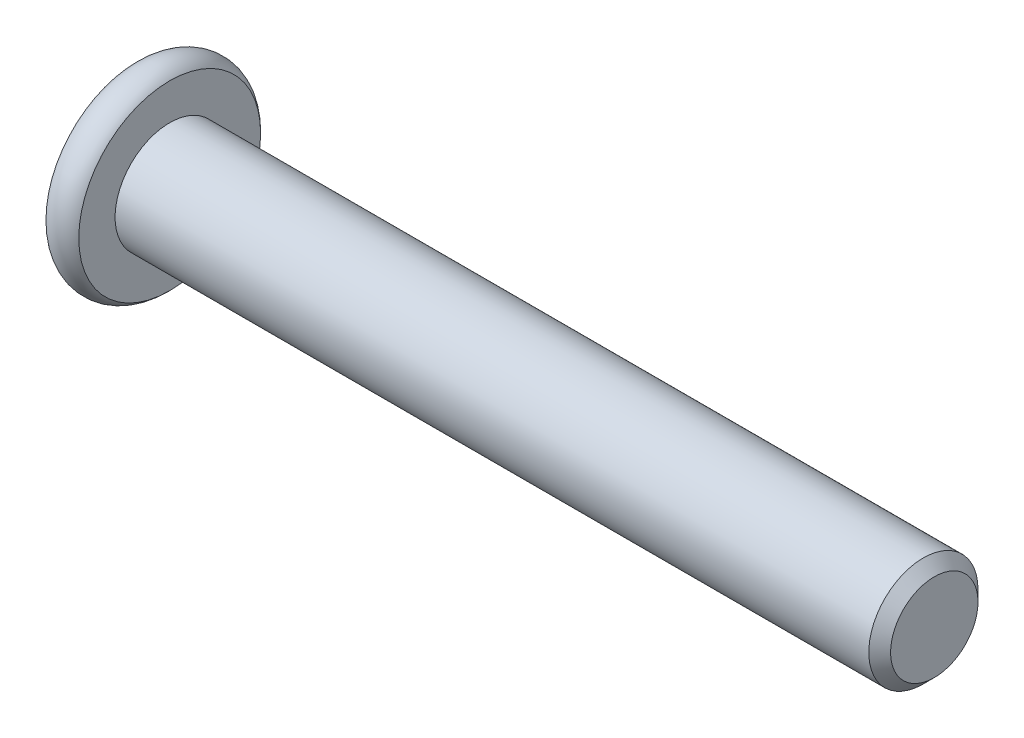
ISO-10303-21;
HEADER;
FILE_DESCRIPTION(('STEP AP214'),'2;1');
FILE_NAME('part.step','',(''),(''),'','','');
FILE_SCHEMA(('AUTOMOTIVE_DESIGN { 1 0 10303 214 1 1 1 1 }'));
ENDSEC;
DATA;
#1=APPLICATION_CONTEXT('core data for automotive mechanical design processes');
#2=APPLICATION_PROTOCOL_DEFINITION('international standard','automotive_design',2000,#1);
#3=PRODUCT_CONTEXT('',#1,'mechanical');
#4=PRODUCT('Part','Part','',(#3));
#5=PRODUCT_RELATED_PRODUCT_CATEGORY('part','',(#4));
#6=PRODUCT_DEFINITION_FORMATION('','',#4);
#7=PRODUCT_DEFINITION_CONTEXT('part definition',#1,'design');
#8=PRODUCT_DEFINITION('design','',#6,#7);
#9=PRODUCT_DEFINITION_SHAPE('','',#8);
#10=(LENGTH_UNIT() NAMED_UNIT(*) SI_UNIT(.MILLI.,.METRE.));
#11=(NAMED_UNIT(*) PLANE_ANGLE_UNIT() SI_UNIT($,.RADIAN.));
#12=(NAMED_UNIT(*) SI_UNIT($,.STERADIAN.) SOLID_ANGLE_UNIT());
#13=UNCERTAINTY_MEASURE_WITH_UNIT(LENGTH_MEASURE(1.E-05),#10,'distance_accuracy_value','');
#14=(GEOMETRIC_REPRESENTATION_CONTEXT(3) GLOBAL_UNCERTAINTY_ASSIGNED_CONTEXT((#13)) GLOBAL_UNIT_ASSIGNED_CONTEXT((#10,
#11,#12)) REPRESENTATION_CONTEXT('',''));
#15=CARTESIAN_POINT('',(0.,0.,0.));
#16=DIRECTION('',(0.,0.,1.));
#17=DIRECTION('',(1.,0.,0.));
#18=AXIS2_PLACEMENT_3D('',#15,#16,#17);
#19=CARTESIAN_POINT('',(-35.,0.,0.));
#20=DIRECTION('',(1.,0.,0.));
#21=DIRECTION('',(0.,0.,-1.));
#22=AXIS2_PLACEMENT_3D('',#19,#20,#21);
#23=CYLINDRICAL_SURFACE('',#22,2.5);
#24=CARTESIAN_POINT('',(-0.5,0.,0.));
#25=DIRECTION('',(1.,0.,0.));
#26=DIRECTION('',(0.,0.,-1.));
#27=AXIS2_PLACEMENT_3D('',#24,#25,#26);
#28=CIRCLE('',#27,2.5);
#29=CARTESIAN_POINT('',(-0.5,0.,-2.5));
#30=VERTEX_POINT('',#29);
#31=EDGE_CURVE('E47',#30,#30,#28,.F.);
#32=ORIENTED_EDGE('',*,*,#31,.T.);
#33=EDGE_LOOP('',(#32));
#34=FACE_BOUND('',#33,.T.);
#35=CARTESIAN_POINT('',(-35.,0.,0.));
#36=DIRECTION('',(-1.,0.,0.));
#37=DIRECTION('',(0.,-1.,0.));
#38=AXIS2_PLACEMENT_3D('',#35,#36,#37);
#39=CIRCLE('',#38,2.5);
#40=CARTESIAN_POINT('',(-35.,-2.50000000000001,0.));
#41=VERTEX_POINT('',#40);
#42=EDGE_CURVE('E123',#41,#41,#39,.F.);
#43=ORIENTED_EDGE('',*,*,#42,.T.);
#44=EDGE_LOOP('',(#43));
#45=FACE_BOUND('',#44,.T.);
#46=ADVANCED_FACE('F33',(#34,#45),#23,.T.);
#47=CARTESIAN_POINT('',(0.,0.,0.));
#48=DIRECTION('',(1.,0.,0.));
#49=DIRECTION('',(0.,0.,-1.));
#50=AXIS2_PLACEMENT_3D('',#47,#48,#49);
#51=PLANE('',#50);
#52=CARTESIAN_POINT('',(0.,0.,0.));
#53=DIRECTION('',(1.,0.,0.));
#54=DIRECTION('',(0.,0.,-1.));
#55=AXIS2_PLACEMENT_3D('',#52,#53,#54);
#56=CIRCLE('',#55,2.);
#57=CARTESIAN_POINT('',(0.,0.,-2.));
#58=VERTEX_POINT('',#57);
#59=EDGE_CURVE('E126',#58,#58,#56,.T.);
#60=ORIENTED_EDGE('',*,*,#59,.T.);
#61=EDGE_LOOP('',(#60));
#62=FACE_BOUND('',#61,.T.);
#63=ADVANCED_FACE('F136',(#62),#51,.T.);
#64=CARTESIAN_POINT('',(0.,0.,0.));
#65=DIRECTION('',(-1.,0.,0.));
#66=DIRECTION('',(0.,0.,1.));
#67=AXIS2_PLACEMENT_3D('',#64,#65,#66);
#68=CONICAL_SURFACE('',#67,2.,0.785398163397447);
#69=ORIENTED_EDGE('',*,*,#31,.F.);
#70=EDGE_LOOP('',(#69));
#71=FACE_BOUND('',#70,.T.);
#72=ORIENTED_EDGE('',*,*,#59,.F.);
#73=EDGE_LOOP('',(#72));
#74=FACE_BOUND('',#73,.T.);
#75=ADVANCED_FACE('F35',(#71,#74),#68,.T.);
#76=CARTESIAN_POINT('',(-36.5,0.,0.));
#77=DIRECTION('',(1.,0.,0.));
#78=DIRECTION('',(0.,1.,0.));
#79=AXIS2_PLACEMENT_3D('',#76,#77,#78);
#80=PLANE('',#79);
#81=CARTESIAN_POINT('',(-36.5,1.39347141364593E-13,0.));
#82=DIRECTION('',(-1.,0.,0.));
#83=DIRECTION('',(0.,-1.,0.));
#84=AXIS2_PLACEMENT_3D('',#81,#82,#83);
#85=CIRCLE('',#84,1.78205080756884);
#86=CARTESIAN_POINT('',(-36.5,-1.7820508075687,0.));
#87=VERTEX_POINT('',#86);
#88=EDGE_CURVE('E241',#87,#87,#85,.T.);
#89=ORIENTED_EDGE('',*,*,#88,.F.);
#90=EDGE_LOOP('',(#89));
#91=FACE_BOUND('',#90,.T.);
#92=CARTESIAN_POINT('',(-36.5,0.,0.));
#93=DIRECTION('',(-1.,0.,0.));
#94=DIRECTION('',(0.,-1.,0.));
#95=AXIS2_PLACEMENT_3D('',#92,#93,#94);
#96=CIRCLE('',#95,4.16143782776615);
#97=CARTESIAN_POINT('',(-36.5,-4.16143782776615,0.));
#98=VERTEX_POINT('',#97);
#99=EDGE_CURVE('E120',#98,#98,#96,.T.);
#100=ORIENTED_EDGE('',*,*,#99,.T.);
#101=EDGE_LOOP('',(#100));
#102=FACE_BOUND('',#101,.T.);
#103=ADVANCED_FACE('F135',(#91,#102),#80,.F.);
#104=CARTESIAN_POINT('',(-35.75,0.,0.));
#105=DIRECTION('',(-1.,0.,0.));
#106=DIRECTION('',(0.,-1.,0.));
#107=AXIS2_PLACEMENT_3D('',#104,#105,#106);
#108=TOROIDAL_SURFACE('',#107,3.5,1.);
#109=ORIENTED_EDGE('',*,*,#99,.F.);
#110=EDGE_LOOP('',(#109));
#111=FACE_BOUND('',#110,.T.);
#112=CARTESIAN_POINT('',(-35.,0.,0.));
#113=DIRECTION('',(-1.,0.,0.));
#114=DIRECTION('',(0.,-1.,0.));
#115=AXIS2_PLACEMENT_3D('',#112,#113,#114);
#116=CIRCLE('',#115,4.16143782776615);
#117=CARTESIAN_POINT('',(-35.,-4.16143782776615,0.));
#118=VERTEX_POINT('',#117);
#119=EDGE_CURVE('E117',#118,#118,#116,.T.);
#120=ORIENTED_EDGE('',*,*,#119,.T.);
#121=EDGE_LOOP('',(#120));
#122=FACE_BOUND('',#121,.T.);
#123=ADVANCED_FACE('F147',(#111,#122),#108,.T.);
#124=CARTESIAN_POINT('',(-35.,4.16143782776615,0.));
#125=DIRECTION('',(-1.,0.,0.));
#126=DIRECTION('',(0.,-1.,0.));
#127=AXIS2_PLACEMENT_3D('',#124,#125,#126);
#128=PLANE('',#127);
#129=ORIENTED_EDGE('',*,*,#42,.F.);
#130=EDGE_LOOP('',(#129));
#131=FACE_BOUND('',#130,.T.);
#132=ORIENTED_EDGE('',*,*,#119,.F.);
#133=EDGE_LOOP('',(#132));
#134=FACE_BOUND('',#133,.T.);
#135=ADVANCED_FACE('F151',(#131,#134),#128,.F.);
#136=CARTESIAN_POINT('',(-36.5,1.39347141364593E-13,0.));
#137=DIRECTION('',(-1.,0.,0.));
#138=DIRECTION('',(0.,-1.,0.));
#139=AXIS2_PLACEMENT_3D('',#136,#137,#138);
#140=CONICAL_SURFACE('',#139,1.78205080756884,0.78539816339745);
#141=ORIENTED_EDGE('',*,*,#88,.T.);
#142=EDGE_LOOP('',(#141));
#143=FACE_BOUND('',#142,.T.);
#144=CARTESIAN_POINT('',(-37.015428085613,-1.74023253176565,1.5));
#145=CARTESIAN_POINT('',(-36.9833811073445,-1.69791724929719,1.5));
#146=CARTESIAN_POINT('',(-36.9516444672841,-1.6553676096678,1.5));
#147=CARTESIAN_POINT('',(-36.8889203936153,-1.56970398156674,1.5));
#148=CARTESIAN_POINT('',(-36.85793314822,-1.52658985542837,1.5));
#149=CARTESIAN_POINT('',(-36.765846164345,-1.39562626326552,1.5));
#150=CARTESIAN_POINT('',(-36.7061145123022,-1.30679868010565,1.5));
#151=CARTESIAN_POINT('',(-36.5887342891013,-1.12044622640204,1.5));
#152=CARTESIAN_POINT('',(-36.5314082774823,-1.02271587306661,1.5));
#153=CARTESIAN_POINT('',(-36.426463214976,-0.822357214965144,1.5));
#154=CARTESIAN_POINT('',(-36.3788114236896,-0.719746931701807,1.5));
#155=CARTESIAN_POINT('',(-36.3205099883151,-0.565852387094983,1.5));
#156=CARTESIAN_POINT('',(-36.3037990535409,-0.516874191424572,1.5));
#157=CARTESIAN_POINT('',(-36.2743077515089,-0.417723988457411,1.5));
#158=CARTESIAN_POINT('',(-36.2615276514219,-0.367551900263777,1.5));
#159=CARTESIAN_POINT('',(-36.2407784202458,-0.267158299056028,1.5));
#160=CARTESIAN_POINT('',(-36.232726061826,-0.216954261864764,1.5));
#161=CARTESIAN_POINT('',(-36.2215916368341,-0.11599491587123,1.5));
#162=CARTESIAN_POINT('',(-36.2185086886377,-0.0652397064614477,1.5));
#163=CARTESIAN_POINT('',(-36.2175473897404,0.0344222234876478,1.5));
#164=CARTESIAN_POINT('',(-36.2194789216952,0.0833271701101816,1.5));
#165=CARTESIAN_POINT('',(-36.2280175729677,0.180724293127313,1.5));
#166=CARTESIAN_POINT('',(-36.2346251420481,0.22921642936182,1.5));
#167=CARTESIAN_POINT('',(-36.2522650626447,0.326258027697099,1.5));
#168=CARTESIAN_POINT('',(-36.263373168201,0.374793507450119,1.5));
#169=CARTESIAN_POINT('',(-36.2894198669595,0.470802295834272,1.5));
#170=CARTESIAN_POINT('',(-36.3043581560035,0.518275688481374,1.5));
#171=CARTESIAN_POINT('',(-36.356839545716,0.667150562065225,1.5));
#172=CARTESIAN_POINT('',(-36.4003351165442,0.766448362426946,1.5));
#173=CARTESIAN_POINT('',(-36.4970587814837,0.960384405673935,1.5));
#174=CARTESIAN_POINT('',(-36.5503217226675,1.05500437383631,1.5));
#175=CARTESIAN_POINT('',(-36.6602258010454,1.23584520321542,1.5));
#176=CARTESIAN_POINT('',(-36.7165682531046,1.3222498694656,1.5));
#177=CARTESIAN_POINT('',(-36.803675572597,1.44954953726483,1.5));
#178=CARTESIAN_POINT('',(-36.8330199906839,1.49143368482433,1.5));
#179=CARTESIAN_POINT('',(-36.8924869182931,1.57462914783254,1.5));
#180=CARTESIAN_POINT('',(-36.9226092115008,1.6159406177259,1.5));
#181=CARTESIAN_POINT('',(-36.9530541181366,1.65701358742563,1.5));
#182=B_SPLINE_CURVE_WITH_KNOTS('',3,(#144,#145,#146,#147,#148,#149,#150,#151,#152,#153,#154,
#155,#156,#157,#158,#159,#160,#161,#162,#163,#164,#165,#166,#167,#168,#169,#170,#171,#172,#173,
#174,#175,#176,#177,#178,#179,#180,#181),.UNSPECIFIED.,.F.,.F.,(4,2,2,2,2,2,2,2,2,2,2,2,2,2,2,2,
2,2,4),(0.,0.159238974218352,0.318517535014536,0.639504781932377,0.979137893799193,
1.31760168934356,1.47272233841622,1.62785352839774,1.78016486537345,1.93244917778277,
2.07904486260296,2.22565464958331,2.37484213303397,2.52401777304037,2.84828365283774,
3.17372975666749,3.48303030530536,3.63644667013907,3.78982082222911),.UNSPECIFIED.);
#183=CARTESIAN_POINT('',(-36.45,-0.8660254037843,1.5));
#184=VERTEX_POINT('',#183);
#185=CARTESIAN_POINT('',(-36.45,0.866025403784577,1.5));
#186=VERTEX_POINT('',#185);
#187=EDGE_CURVE('E101',#184,#186,#182,.T.);
#188=ORIENTED_EDGE('',*,*,#187,.F.);
#189=CARTESIAN_POINT('',(-36.4501154816001,-1.73216627762258,-0.000200000000001602));
#190=CARTESIAN_POINT('',(-36.4203654760674,-1.70239359975901,0.0513677907370732));
#191=CARTESIAN_POINT('',(-36.3923624839104,-1.67212305186341,0.103797917665199));
#192=CARTESIAN_POINT('',(-36.3410892304402,-1.61039789003605,0.210709034055595));
#193=CARTESIAN_POINT('',(-36.3178475050444,-1.578937403126,0.26520019581466));
#194=CARTESIAN_POINT('',(-36.2780337289923,-1.51549879897973,0.375079081357247));
#195=CARTESIAN_POINT('',(-36.2613615856709,-1.48353684526796,0.430438809095198));
#196=CARTESIAN_POINT('',(-36.2356744568182,-1.41890915196197,0.542377257477151));
#197=CARTESIAN_POINT('',(-36.2266402904789,-1.38624538781104,0.59895255655301));
#198=CARTESIAN_POINT('',(-36.2184890812269,-1.32995210095285,0.696455389516443));
#199=CARTESIAN_POINT('',(-36.2172822529893,-1.3063953331111,0.737256908280468));
#200=CARTESIAN_POINT('',(-36.2193140571623,-1.25932335290179,0.818787969615861));
#201=CARTESIAN_POINT('',(-36.2225536707483,-1.23580815085299,0.859517494314632));
#202=CARTESIAN_POINT('',(-36.233291985982,-1.18900414978413,0.940584402163419));
#203=CARTESIAN_POINT('',(-36.2407946530188,-1.16571558211705,0.980921384598291));
#204=CARTESIAN_POINT('',(-36.2596516119283,-1.11952932016321,1.06091833691403));
#205=CARTESIAN_POINT('',(-36.2710075570186,-1.09663179808772,1.10057800851621));
#206=CARTESIAN_POINT('',(-36.3047216475927,-1.03798159809684,1.20216313477449));
#207=CARTESIAN_POINT('',(-36.3296218490934,-1.00259267147451,1.26345855370969));
#208=CARTESIAN_POINT('',(-36.3716566532716,-0.950557780604235,1.35358562846331));
#209=CARTESIAN_POINT('',(-36.3864251535591,-0.933410759677007,1.38328513990772));
#210=CARTESIAN_POINT('',(-36.4173105659402,-0.899432101996267,1.44213790138375));
#211=CARTESIAN_POINT('',(-36.4334268341218,-0.88260031928557,1.47129140422064));
#212=CARTESIAN_POINT('',(-36.4501154816001,-0.865909933730462,1.5002));
#213=B_SPLINE_CURVE_WITH_KNOTS('',3,(#189,#190,#191,#192,#193,#194,#195,#196,#197,#198,#199,
#200,#201,#202,#203,#204,#205,#206,#207,#208,#209,#210,#211,#212),.UNSPECIFIED.,.F.,.F.,(4,2,2,
2,2,2,2,2,2,2,2,4),(0.,0.199829143693307,0.400822987382389,0.598623720538182,0.795926240188894,
0.937113067959886,1.07833105577193,1.21968061668223,1.36109089931055,1.58570969637566,
1.69770705470964,1.80965120737194),.UNSPECIFIED.);
#214=CARTESIAN_POINT('',(-36.4500000000001,-1.73205080756874,0.));
#215=VERTEX_POINT('',#214);
#216=EDGE_CURVE('E197',#215,#184,#213,.T.);
#217=ORIENTED_EDGE('',*,*,#216,.F.);
#218=CARTESIAN_POINT('',(-36.4501154816001,-0.865909933730461,-1.5002));
#219=CARTESIAN_POINT('',(-36.4203654760674,-0.895682611594026,-1.44863220926292));
#220=CARTESIAN_POINT('',(-36.3923624839104,-0.925953159489625,-1.3962020823348));
#221=CARTESIAN_POINT('',(-36.3410892304402,-0.987678321316984,-1.2892909659444));
#222=CARTESIAN_POINT('',(-36.3178475050444,-1.01913880822704,-1.23479980418534));
#223=CARTESIAN_POINT('',(-36.2780337289923,-1.08257741237331,-1.12492091864275));
#224=CARTESIAN_POINT('',(-36.2613615856709,-1.11453936608508,-1.0695611909048));
#225=CARTESIAN_POINT('',(-36.2356744568181,-1.17916705939107,-0.957622742522845));
#226=CARTESIAN_POINT('',(-36.2266402904789,-1.211830823542,-0.901047443446987));
#227=CARTESIAN_POINT('',(-36.2184890812269,-1.26812411040019,-0.803544610483555));
#228=CARTESIAN_POINT('',(-36.2172822529893,-1.29168087824194,-0.762743091719529));
#229=CARTESIAN_POINT('',(-36.2193140571623,-1.33875285845125,-0.681212030384138));
#230=CARTESIAN_POINT('',(-36.2225536707484,-1.36226806050005,-0.640482505685366));
#231=CARTESIAN_POINT('',(-36.233291985982,-1.40907206156891,-0.55941559783658));
#232=CARTESIAN_POINT('',(-36.2407946530188,-1.43236062923598,-0.519078615401707));
#233=CARTESIAN_POINT('',(-36.2596516119283,-1.47854689118983,-0.439081663085964));
#234=CARTESIAN_POINT('',(-36.2710075570186,-1.50144441326532,-0.399421991483788));
#235=CARTESIAN_POINT('',(-36.3047216475927,-1.5600946132562,-0.297836865225512));
#236=CARTESIAN_POINT('',(-36.3296218490934,-1.59548353987853,-0.236541446290307));
#237=CARTESIAN_POINT('',(-36.3716566532716,-1.6475184307488,-0.146414371536682));
#238=CARTESIAN_POINT('',(-36.3864251535591,-1.66466545167603,-0.116714860092278));
#239=CARTESIAN_POINT('',(-36.4173105659402,-1.69864410935677,-0.0578620986162455));
#240=CARTESIAN_POINT('',(-36.4334268341218,-1.71547589206747,-0.0287085957793603));
#241=CARTESIAN_POINT('',(-36.4501154816001,-1.73216627762258,0.00020000000000102));
#242=B_SPLINE_CURVE_WITH_KNOTS('',3,(#218,#219,#220,#221,#222,#223,#224,#225,#226,#227,#228,
#229,#230,#231,#232,#233,#234,#235,#236,#237,#238,#239,#240,#241),.UNSPECIFIED.,.F.,.F.,(4,2,2,
2,2,2,2,2,2,2,2,4),(0.,0.199829143693303,0.40082298738239,0.598623720538186,0.795926240188894,
0.937113067959886,1.07833105577193,1.21968061668222,1.36109089931055,1.58570969637566,
1.69770705470964,1.80965120737194),.UNSPECIFIED.);
#243=CARTESIAN_POINT('',(-36.45,-0.866025403784298,-1.5));
#244=VERTEX_POINT('',#243);
#245=EDGE_CURVE('E191',#244,#215,#242,.T.);
#246=ORIENTED_EDGE('',*,*,#245,.F.);
#247=CARTESIAN_POINT('',(-37.015428085613,-1.74023253176566,-1.5));
#248=CARTESIAN_POINT('',(-36.9833811073445,-1.69791724929719,-1.5));
#249=CARTESIAN_POINT('',(-36.9516444672841,-1.6553676096678,-1.5));
#250=CARTESIAN_POINT('',(-36.8889203936153,-1.56970398156674,-1.5));
#251=CARTESIAN_POINT('',(-36.85793314822,-1.52658985542837,-1.5));
#252=CARTESIAN_POINT('',(-36.765846164345,-1.39562626326552,-1.5));
#253=CARTESIAN_POINT('',(-36.7061145123022,-1.30679868010565,-1.5));
#254=CARTESIAN_POINT('',(-36.5887342891013,-1.12044622640204,-1.5));
#255=CARTESIAN_POINT('',(-36.5314082774823,-1.02271587306662,-1.5));
#256=CARTESIAN_POINT('',(-36.426463214976,-0.822357214965153,-1.5));
#257=CARTESIAN_POINT('',(-36.3788114236896,-0.719746931701816,-1.5));
#258=CARTESIAN_POINT('',(-36.3205099883151,-0.565852387094989,-1.5));
#259=CARTESIAN_POINT('',(-36.3037990535409,-0.516874191424577,-1.5));
#260=CARTESIAN_POINT('',(-36.2743077515089,-0.417723988457414,-1.5));
#261=CARTESIAN_POINT('',(-36.261527651422,-0.367551900263781,-1.5));
#262=CARTESIAN_POINT('',(-36.2407784202458,-0.267158299056031,-1.5));
#263=CARTESIAN_POINT('',(-36.232726061826,-0.216954261864767,-1.5));
#264=CARTESIAN_POINT('',(-36.2215916368341,-0.115994915871232,-1.5));
#265=CARTESIAN_POINT('',(-36.2185086886377,-0.065239706461449,-1.5));
#266=CARTESIAN_POINT('',(-36.2175473897404,0.0344222234876464,-1.5));
#267=CARTESIAN_POINT('',(-36.2194789216952,0.0833271701101799,-1.5));
#268=CARTESIAN_POINT('',(-36.2280175729677,0.180724293127312,-1.5));
#269=CARTESIAN_POINT('',(-36.2346251420481,0.229216429361819,-1.5));
#270=CARTESIAN_POINT('',(-36.2522650626447,0.326258027697098,-1.5));
#271=CARTESIAN_POINT('',(-36.263373168201,0.374793507450118,-1.5));
#272=CARTESIAN_POINT('',(-36.2894198669595,0.470802295834271,-1.5));
#273=CARTESIAN_POINT('',(-36.3043581560035,0.518275688481373,-1.5));
#274=CARTESIAN_POINT('',(-36.356839545716,0.667150562065221,-1.5));
#275=CARTESIAN_POINT('',(-36.4003351165442,0.766448362426942,-1.5));
#276=CARTESIAN_POINT('',(-36.4970587814836,0.960384405673931,-1.5));
#277=CARTESIAN_POINT('',(-36.5503217226675,1.0550043738363,-1.5));
#278=CARTESIAN_POINT('',(-36.6602258010454,1.23584520321542,-1.5));
#279=CARTESIAN_POINT('',(-36.7165682531046,1.3222498694656,-1.5));
#280=CARTESIAN_POINT('',(-36.803675572597,1.44954953726483,-1.5));
#281=CARTESIAN_POINT('',(-36.8330199906839,1.49143368482433,-1.5));
#282=CARTESIAN_POINT('',(-36.8924869182931,1.57462914783254,-1.5));
#283=CARTESIAN_POINT('',(-36.9226092115008,1.61594061772589,-1.5));
#284=CARTESIAN_POINT('',(-36.9530541181366,1.65701358742563,-1.5));
#285=B_SPLINE_CURVE_WITH_KNOTS('',3,(#247,#248,#249,#250,#251,#252,#253,#254,#255,#256,#257,
#258,#259,#260,#261,#262,#263,#264,#265,#266,#267,#268,#269,#270,#271,#272,#273,#274,#275,#276,
#277,#278,#279,#280,#281,#282,#283,#284),.UNSPECIFIED.,.F.,.F.,(4,2,2,2,2,2,2,2,2,2,2,2,2,2,2,2,
2,2,4),(0.,0.159238974218353,0.318517535014537,0.639504781932376,0.979137893799182,
1.31760168934355,1.47272233841622,1.62785352839774,1.78016486537345,1.93244917778277,
2.07904486260296,2.22565464958331,2.37484213303397,2.52401777304037,2.84828365283773,
3.17372975666748,3.48303030530536,3.63644667013907,3.78982082222911),.UNSPECIFIED.);
#286=CARTESIAN_POINT('',(-36.45,0.866025403784578,-1.5));
#287=VERTEX_POINT('',#286);
#288=EDGE_CURVE('E54',#287,#244,#285,.F.);
#289=ORIENTED_EDGE('',*,*,#288,.F.);
#290=CARTESIAN_POINT('',(-36.4501154816001,1.73216627762285,0.000200000000001159));
#291=CARTESIAN_POINT('',(-36.4203654760674,1.70239359975929,-0.0513677907370737));
#292=CARTESIAN_POINT('',(-36.3923624839103,1.67212305186369,-0.103797917665199));
#293=CARTESIAN_POINT('',(-36.3410892304402,1.61039789003633,-0.210709034055595));
#294=CARTESIAN_POINT('',(-36.3178475050444,1.57893740312628,-0.265200195814659));
#295=CARTESIAN_POINT('',(-36.2780337289923,1.51549879898001,-0.375079081357246));
#296=CARTESIAN_POINT('',(-36.2613615856709,1.48353684526824,-0.430438809095196));
#297=CARTESIAN_POINT('',(-36.2356744568181,1.41890915196225,-0.542377257477146));
#298=CARTESIAN_POINT('',(-36.2266402904789,1.38624538781132,-0.598952556553004));
#299=CARTESIAN_POINT('',(-36.2184890812269,1.32995210095314,-0.696455389516436));
#300=CARTESIAN_POINT('',(-36.2172822529893,1.30639533311138,-0.737256908280461));
#301=CARTESIAN_POINT('',(-36.2193140571623,1.25932335290208,-0.818787969615853));
#302=CARTESIAN_POINT('',(-36.2225536707483,1.23580815085327,-0.859517494314625));
#303=CARTESIAN_POINT('',(-36.233291985982,1.18900414978441,-0.940584402163411));
#304=CARTESIAN_POINT('',(-36.2407946530188,1.16571558211734,-0.980921384598283));
#305=CARTESIAN_POINT('',(-36.2596516119283,1.11952932016349,-1.06091833691403));
#306=CARTESIAN_POINT('',(-36.2710075570186,1.096631798088,-1.1005780085162));
#307=CARTESIAN_POINT('',(-36.3047216475927,1.03798159809713,-1.20216313477448));
#308=CARTESIAN_POINT('',(-36.3296218490934,1.0025926714748,-1.26345855370968));
#309=CARTESIAN_POINT('',(-36.3716566532716,0.950557780604515,-1.35358562846331));
#310=CARTESIAN_POINT('',(-36.3864251535591,0.933410759677288,-1.38328513990772));
#311=CARTESIAN_POINT('',(-36.4173105659402,0.899432101996547,-1.44213790138375));
#312=CARTESIAN_POINT('',(-36.4334268341217,0.88260031928585,-1.47129140422064));
#313=CARTESIAN_POINT('',(-36.4501154816001,0.865909933730741,-1.5002));
#314=B_SPLINE_CURVE_WITH_KNOTS('',3,(#290,#291,#292,#293,#294,#295,#296,#297,#298,#299,#300,
#301,#302,#303,#304,#305,#306,#307,#308,#309,#310,#311,#312,#313),.UNSPECIFIED.,.F.,.F.,(4,2,2,
2,2,2,2,2,2,2,2,4),(0.,0.199829143693308,0.400822987382388,0.598623720538179,0.795926240188885,
0.937113067959877,1.07833105577192,1.21968061668222,1.36109089931054,1.58570969637565,
1.69770705470963,1.80965120737194),.UNSPECIFIED.);
#315=CARTESIAN_POINT('',(-36.45,1.73205080756902,0.));
#316=VERTEX_POINT('',#315);
#317=EDGE_CURVE('E11',#316,#287,#314,.T.);
#318=ORIENTED_EDGE('',*,*,#317,.F.);
#319=CARTESIAN_POINT('',(-36.4501154816001,0.86590993373074,1.5002));
#320=CARTESIAN_POINT('',(-36.4203654760674,0.895682611594305,1.44863220926292));
#321=CARTESIAN_POINT('',(-36.3923624839104,0.925953159489904,1.3962020823348));
#322=CARTESIAN_POINT('',(-36.3410892304402,0.987678321317261,1.2892909659444));
#323=CARTESIAN_POINT('',(-36.3178475050444,1.01913880822731,1.23479980418534));
#324=CARTESIAN_POINT('',(-36.2780337289923,1.08257741237358,1.12492091864275));
#325=CARTESIAN_POINT('',(-36.2613615856709,1.11453936608535,1.0695611909048));
#326=CARTESIAN_POINT('',(-36.2356744568181,1.17916705939134,0.95762274252285));
#327=CARTESIAN_POINT('',(-36.2266402904789,1.21183082354227,0.901047443446993));
#328=CARTESIAN_POINT('',(-36.2184890812269,1.26812411040046,0.803544610483562));
#329=CARTESIAN_POINT('',(-36.2172822529893,1.29168087824221,0.762743091719537));
#330=CARTESIAN_POINT('',(-36.2193140571623,1.33875285845152,0.681212030384145));
#331=CARTESIAN_POINT('',(-36.2225536707483,1.36226806050032,0.640482505685374));
#332=CARTESIAN_POINT('',(-36.233291985982,1.40907206156919,0.559415597836588));
#333=CARTESIAN_POINT('',(-36.2407946530188,1.43236062923626,0.519078615401716));
#334=CARTESIAN_POINT('',(-36.2596516119283,1.4785468911901,0.439081663085974));
#335=CARTESIAN_POINT('',(-36.2710075570186,1.50144441326559,0.399421991483797));
#336=CARTESIAN_POINT('',(-36.3047216475927,1.56009461325647,0.297836865225519));
#337=CARTESIAN_POINT('',(-36.3296218490934,1.5954835398788,0.236541446290315));
#338=CARTESIAN_POINT('',(-36.3716566532716,1.64751843074908,0.146414371536689));
#339=CARTESIAN_POINT('',(-36.3864251535591,1.66466545167631,0.116714860092283));
#340=CARTESIAN_POINT('',(-36.4173105659402,1.69864410935705,0.0578620986162484));
#341=CARTESIAN_POINT('',(-36.4334268341217,1.71547589206775,0.0287085957793618));
#342=CARTESIAN_POINT('',(-36.4501154816001,1.73216627762285,-0.000200000000000584));
#343=B_SPLINE_CURVE_WITH_KNOTS('',3,(#319,#320,#321,#322,#323,#324,#325,#326,#327,#328,#329,
#330,#331,#332,#333,#334,#335,#336,#337,#338,#339,#340,#341,#342),.UNSPECIFIED.,.F.,.F.,(4,2,2,
2,2,2,2,2,2,2,2,4),(0.,0.199829143693303,0.400822987382385,0.59862372053818,0.795926240188883,
0.937113067959875,1.07833105577192,1.21968061668221,1.36109089931054,1.58570969637565,
1.69770705470963,1.80965120737194),.UNSPECIFIED.);
#344=EDGE_CURVE('E92',#186,#316,#343,.T.);
#345=ORIENTED_EDGE('',*,*,#344,.F.);
#346=EDGE_LOOP('',(#188,#217,#246,#289,#318,#345));
#347=FACE_BOUND('',#346,.T.);
#348=ADVANCED_FACE('F91',(#143,#347),#140,.F.);
#349=CARTESIAN_POINT('',(-34.2,2.83669796449914E-13,0.));
#350=DIRECTION('',(-1.,0.,0.));
#351=DIRECTION('',(0.,-1.,0.));
#352=AXIS2_PLACEMENT_3D('',#349,#350,#351);
#353=PLANE('',#352);
#354=DIRECTION('',(0.,0.5,-0.866025403784439));
#355=VECTOR('',#354,1.);
#356=CARTESIAN_POINT('',(-34.2,0.866025403784569,1.5));
#357=LINE('',#356,#355);
#358=CARTESIAN_POINT('',(-34.2,0.866025403784569,1.5));
#359=VERTEX_POINT('',#358);
#360=CARTESIAN_POINT('',(-34.2,1.73205080756901,0.));
#361=VERTEX_POINT('',#360);
#362=EDGE_CURVE('E100',#359,#361,#357,.T.);
#363=ORIENTED_EDGE('',*,*,#362,.T.);
#364=DIRECTION('',(0.,-0.5,-0.866025403784439));
#365=VECTOR('',#364,1.);
#366=CARTESIAN_POINT('',(-34.2,1.73205080756901,0.));
#367=LINE('',#366,#365);
#368=CARTESIAN_POINT('',(-34.2,0.866025403784569,-1.5));
#369=VERTEX_POINT('',#368);
#370=EDGE_CURVE('E105',#361,#369,#367,.T.);
#371=ORIENTED_EDGE('',*,*,#370,.T.);
#372=DIRECTION('',(0.,-1.,0.));
#373=VECTOR('',#372,1.);
#374=CARTESIAN_POINT('',(-34.2,0.866025403784569,-1.5));
#375=LINE('',#374,#373);
#376=CARTESIAN_POINT('',(-34.2,-0.866025403784307,-1.5));
#377=VERTEX_POINT('',#376);
#378=EDGE_CURVE('E223',#369,#377,#375,.T.);
#379=ORIENTED_EDGE('',*,*,#378,.T.);
#380=DIRECTION('',(0.,-0.5,0.866025403784439));
#381=VECTOR('',#380,1.);
#382=CARTESIAN_POINT('',(-34.2,-0.866025403784307,-1.5));
#383=LINE('',#382,#381);
#384=CARTESIAN_POINT('',(-34.2,-1.73205080756875,0.));
#385=VERTEX_POINT('',#384);
#386=EDGE_CURVE('E227',#377,#385,#383,.T.);
#387=ORIENTED_EDGE('',*,*,#386,.T.);
#388=DIRECTION('',(0.,0.5,0.866025403784439));
#389=VECTOR('',#388,1.);
#390=CARTESIAN_POINT('',(-34.2,-1.73205080756875,0.));
#391=LINE('',#390,#389);
#392=CARTESIAN_POINT('',(-34.2,-0.866025403784308,1.5));
#393=VERTEX_POINT('',#392);
#394=EDGE_CURVE('E113',#385,#393,#391,.T.);
#395=ORIENTED_EDGE('',*,*,#394,.T.);
#396=DIRECTION('',(0.,1.,0.));
#397=VECTOR('',#396,1.);
#398=CARTESIAN_POINT('',(-34.2,-0.866025403784308,1.5));
#399=LINE('',#398,#397);
#400=EDGE_CURVE('E108',#393,#359,#399,.T.);
#401=ORIENTED_EDGE('',*,*,#400,.T.);
#402=EDGE_LOOP('',(#363,#371,#379,#387,#395,#401));
#403=FACE_BOUND('',#402,.T.);
#404=ADVANCED_FACE('F177',(#403),#353,.T.);
#405=CARTESIAN_POINT('',(-34.2,1.73205080756901,0.));
#406=DIRECTION('',(0.,0.866025403784439,-0.5));
#407=DIRECTION('',(0.,0.5,0.866025403784439));
#408=AXIS2_PLACEMENT_3D('',#405,#406,#407);
#409=PLANE('',#408);
#410=DIRECTION('',(-1.,0.,0.));
#411=VECTOR('',#410,1.);
#412=CARTESIAN_POINT('',(-34.2,1.73205080756901,0.));
#413=LINE('',#412,#411);
#414=EDGE_CURVE('E98',#361,#316,#413,.T.);
#415=ORIENTED_EDGE('',*,*,#414,.T.);
#416=ORIENTED_EDGE('',*,*,#317,.T.);
#417=DIRECTION('',(-1.,0.,0.));
#418=VECTOR('',#417,1.);
#419=CARTESIAN_POINT('',(-34.2,0.866025403784569,-1.5));
#420=LINE('',#419,#418);
#421=EDGE_CURVE('E107',#369,#287,#420,.T.);
#422=ORIENTED_EDGE('',*,*,#421,.F.);
#423=ORIENTED_EDGE('',*,*,#370,.F.);
#424=EDGE_LOOP('',(#415,#416,#422,#423));
#425=FACE_BOUND('',#424,.T.);
#426=ADVANCED_FACE('F103',(#425),#409,.F.);
#427=CARTESIAN_POINT('',(-34.2,0.866025403784569,-1.5));
#428=DIRECTION('',(0.,0.,-1.));
#429=DIRECTION('',(-1.,0.,0.));
#430=AXIS2_PLACEMENT_3D('',#427,#428,#429);
#431=PLANE('',#430);
#432=ORIENTED_EDGE('',*,*,#421,.T.);
#433=ORIENTED_EDGE('',*,*,#288,.T.);
#434=DIRECTION('',(-1.,0.,0.));
#435=VECTOR('',#434,1.);
#436=CARTESIAN_POINT('',(-34.2,-0.866025403784307,-1.5));
#437=LINE('',#436,#435);
#438=EDGE_CURVE('E110',#377,#244,#437,.T.);
#439=ORIENTED_EDGE('',*,*,#438,.F.);
#440=ORIENTED_EDGE('',*,*,#378,.F.);
#441=EDGE_LOOP('',(#432,#433,#439,#440));
#442=FACE_BOUND('',#441,.T.);
#443=ADVANCED_FACE('F212',(#442),#431,.F.);
#444=CARTESIAN_POINT('',(-34.2,-0.866025403784307,-1.5));
#445=DIRECTION('',(0.,-0.866025403784438,-0.5));
#446=DIRECTION('',(0.,0.5,-0.866025403784439));
#447=AXIS2_PLACEMENT_3D('',#444,#445,#446);
#448=PLANE('',#447);
#449=ORIENTED_EDGE('',*,*,#438,.T.);
#450=ORIENTED_EDGE('',*,*,#245,.T.);
#451=DIRECTION('',(-1.,0.,0.));
#452=VECTOR('',#451,1.);
#453=CARTESIAN_POINT('',(-34.2,-1.73205080756875,0.));
#454=LINE('',#453,#452);
#455=EDGE_CURVE('E237',#385,#215,#454,.T.);
#456=ORIENTED_EDGE('',*,*,#455,.F.);
#457=ORIENTED_EDGE('',*,*,#386,.F.);
#458=EDGE_LOOP('',(#449,#450,#456,#457));
#459=FACE_BOUND('',#458,.T.);
#460=ADVANCED_FACE('F207',(#459),#448,.F.);
#461=CARTESIAN_POINT('',(-34.2,-1.73205080756875,0.));
#462=DIRECTION('',(0.,-0.866025403784439,0.5));
#463=DIRECTION('',(0.,-0.5,-0.866025403784439));
#464=AXIS2_PLACEMENT_3D('',#461,#462,#463);
#465=PLANE('',#464);
#466=ORIENTED_EDGE('',*,*,#455,.T.);
#467=ORIENTED_EDGE('',*,*,#216,.T.);
#468=DIRECTION('',(-1.,0.,0.));
#469=VECTOR('',#468,1.);
#470=CARTESIAN_POINT('',(-34.2,-0.866025403784308,1.5));
#471=LINE('',#470,#469);
#472=EDGE_CURVE('E234',#393,#184,#471,.T.);
#473=ORIENTED_EDGE('',*,*,#472,.F.);
#474=ORIENTED_EDGE('',*,*,#394,.F.);
#475=EDGE_LOOP('',(#466,#467,#473,#474));
#476=FACE_BOUND('',#475,.T.);
#477=ADVANCED_FACE('F204',(#476),#465,.F.);
#478=CARTESIAN_POINT('',(-34.2,-0.866025403784308,1.5));
#479=DIRECTION('',(0.,0.,1.));
#480=DIRECTION('',(1.,0.,0.));
#481=AXIS2_PLACEMENT_3D('',#478,#479,#480);
#482=PLANE('',#481);
#483=ORIENTED_EDGE('',*,*,#472,.T.);
#484=ORIENTED_EDGE('',*,*,#187,.T.);
#485=DIRECTION('',(-1.,0.,0.));
#486=VECTOR('',#485,1.);
#487=CARTESIAN_POINT('',(-34.2,0.866025403784569,1.5));
#488=LINE('',#487,#486);
#489=EDGE_CURVE('E61',#359,#186,#488,.T.);
#490=ORIENTED_EDGE('',*,*,#489,.F.);
#491=ORIENTED_EDGE('',*,*,#400,.F.);
#492=EDGE_LOOP('',(#483,#484,#490,#491));
#493=FACE_BOUND('',#492,.T.);
#494=ADVANCED_FACE('F158',(#493),#482,.F.);
#495=CARTESIAN_POINT('',(-34.2,0.866025403784569,1.5));
#496=DIRECTION('',(0.,0.866025403784439,0.5));
#497=DIRECTION('',(0.,-0.5,0.866025403784439));
#498=AXIS2_PLACEMENT_3D('',#495,#496,#497);
#499=PLANE('',#498);
#500=ORIENTED_EDGE('',*,*,#489,.T.);
#501=ORIENTED_EDGE('',*,*,#344,.T.);
#502=ORIENTED_EDGE('',*,*,#414,.F.);
#503=ORIENTED_EDGE('',*,*,#362,.F.);
#504=EDGE_LOOP('',(#500,#501,#502,#503));
#505=FACE_BOUND('',#504,.T.);
#506=ADVANCED_FACE('F97',(#505),#499,.F.);
#507=CLOSED_SHELL('',(#46,#63,#75,#103,#123,#135,#348,#404,#426,#443,#460,#477,#494,#506));
#508=MANIFOLD_SOLID_BREP('B2',#507);
#509=ADVANCED_BREP_SHAPE_REPRESENTATION('',(#18,#508),#14);
#510=SHAPE_DEFINITION_REPRESENTATION(#9,#509);
ENDSEC;
END-ISO-10303-21;
